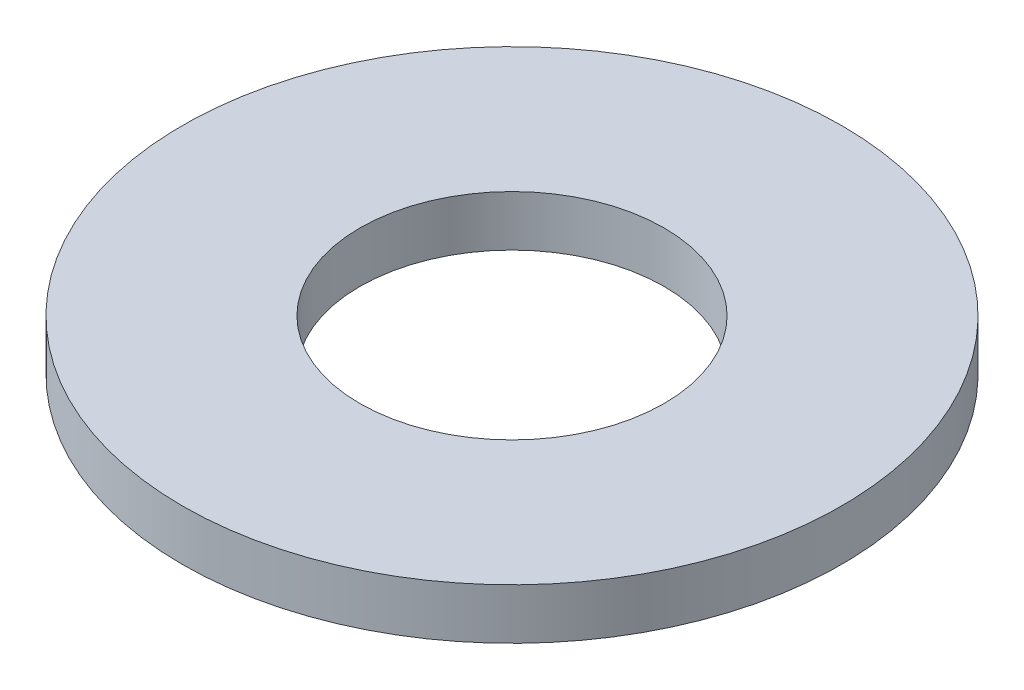
ISO-10303-21;
HEADER;
FILE_DESCRIPTION(('STEP AP214'),'2;1');
FILE_NAME('part.step','',(''),(''),'','','');
FILE_SCHEMA(('AUTOMOTIVE_DESIGN { 1 0 10303 214 1 1 1 1 }'));
ENDSEC;
DATA;
#1=APPLICATION_CONTEXT('core data for automotive mechanical design processes');
#2=APPLICATION_PROTOCOL_DEFINITION('international standard','automotive_design',2000,#1);
#3=PRODUCT_CONTEXT('',#1,'mechanical');
#4=PRODUCT('Part','Part','',(#3));
#5=PRODUCT_RELATED_PRODUCT_CATEGORY('part','',(#4));
#6=PRODUCT_DEFINITION_FORMATION('','',#4);
#7=PRODUCT_DEFINITION_CONTEXT('part definition',#1,'design');
#8=PRODUCT_DEFINITION('design','',#6,#7);
#9=PRODUCT_DEFINITION_SHAPE('','',#8);
#10=(LENGTH_UNIT() NAMED_UNIT(*) SI_UNIT(.MILLI.,.METRE.));
#11=(NAMED_UNIT(*) PLANE_ANGLE_UNIT() SI_UNIT($,.RADIAN.));
#12=(NAMED_UNIT(*) SI_UNIT($,.STERADIAN.) SOLID_ANGLE_UNIT());
#13=UNCERTAINTY_MEASURE_WITH_UNIT(LENGTH_MEASURE(1.E-05),#10,'distance_accuracy_value','');
#14=(GEOMETRIC_REPRESENTATION_CONTEXT(3) GLOBAL_UNCERTAINTY_ASSIGNED_CONTEXT((#13)) GLOBAL_UNIT_ASSIGNED_CONTEXT((#10,
#11,#12)) REPRESENTATION_CONTEXT('',''));
#15=CARTESIAN_POINT('',(0.,0.,0.));
#16=DIRECTION('',(0.,0.,1.));
#17=DIRECTION('',(1.,0.,0.));
#18=AXIS2_PLACEMENT_3D('',#15,#16,#17);
#19=CARTESIAN_POINT('',(0.,1.,0.));
#20=DIRECTION('',(0.,1.,0.));
#21=DIRECTION('',(0.,0.,1.));
#22=AXIS2_PLACEMENT_3D('',#19,#20,#21);
#23=PLANE('',#22);
#24=CARTESIAN_POINT('',(0.,1.,0.));
#25=DIRECTION('',(0.,1.,0.));
#26=DIRECTION('',(0.,0.,1.));
#27=AXIS2_PLACEMENT_3D('',#24,#25,#26);
#28=CIRCLE('',#27,6.5);
#29=CARTESIAN_POINT('',(0.,1.,6.5));
#30=VERTEX_POINT('',#29);
#31=EDGE_CURVE('E10',#30,#30,#28,.T.);
#32=ORIENTED_EDGE('',*,*,#31,.T.);
#33=EDGE_LOOP('',(#32));
#34=FACE_BOUND('',#33,.T.);
#35=CARTESIAN_POINT('',(0.,1.,0.));
#36=DIRECTION('',(0.,1.,0.));
#37=DIRECTION('',(0.,0.,1.));
#38=AXIS2_PLACEMENT_3D('',#35,#36,#37);
#39=CIRCLE('',#38,3.);
#40=CARTESIAN_POINT('',(0.,1.,3.));
#41=VERTEX_POINT('',#40);
#42=EDGE_CURVE('E48',#41,#41,#39,.T.);
#43=ORIENTED_EDGE('',*,*,#42,.F.);
#44=EDGE_LOOP('',(#43));
#45=FACE_BOUND('',#44,.T.);
#46=ADVANCED_FACE('F37',(#34,#45),#23,.T.);
#47=CARTESIAN_POINT('',(0.,0.,0.));
#48=DIRECTION('',(0.,1.,0.));
#49=DIRECTION('',(0.,0.,1.));
#50=AXIS2_PLACEMENT_3D('',#47,#48,#49);
#51=PLANE('',#50);
#52=CARTESIAN_POINT('',(0.,0.,0.));
#53=DIRECTION('',(0.,1.,0.));
#54=DIRECTION('',(0.,0.,1.));
#55=AXIS2_PLACEMENT_3D('',#52,#53,#54);
#56=CIRCLE('',#55,6.5);
#57=CARTESIAN_POINT('',(0.,0.,6.5));
#58=VERTEX_POINT('',#57);
#59=EDGE_CURVE('E41',#58,#58,#56,.T.);
#60=ORIENTED_EDGE('',*,*,#59,.F.);
#61=EDGE_LOOP('',(#60));
#62=FACE_BOUND('',#61,.T.);
#63=CARTESIAN_POINT('',(0.,0.,0.));
#64=DIRECTION('',(0.,1.,0.));
#65=DIRECTION('',(0.,0.,1.));
#66=AXIS2_PLACEMENT_3D('',#63,#64,#65);
#67=CIRCLE('',#66,3.);
#68=CARTESIAN_POINT('',(0.,0.,3.));
#69=VERTEX_POINT('',#68);
#70=EDGE_CURVE('E50',#69,#69,#67,.T.);
#71=ORIENTED_EDGE('',*,*,#70,.T.);
#72=EDGE_LOOP('',(#71));
#73=FACE_BOUND('',#72,.T.);
#74=ADVANCED_FACE('F60',(#62,#73),#51,.F.);
#75=CARTESIAN_POINT('',(0.,1.,0.));
#76=DIRECTION('',(0.,-1.,0.));
#77=DIRECTION('',(0.,0.,-1.));
#78=AXIS2_PLACEMENT_3D('',#75,#76,#77);
#79=CYLINDRICAL_SURFACE('',#78,6.5);
#80=ORIENTED_EDGE('',*,*,#31,.F.);
#81=EDGE_LOOP('',(#80));
#82=FACE_BOUND('',#81,.T.);
#83=ORIENTED_EDGE('',*,*,#59,.T.);
#84=EDGE_LOOP('',(#83));
#85=FACE_BOUND('',#84,.T.);
#86=ADVANCED_FACE('F39',(#82,#85),#79,.T.);
#87=CARTESIAN_POINT('',(0.,1.,0.));
#88=DIRECTION('',(0.,-1.,0.));
#89=DIRECTION('',(0.,0.,-1.));
#90=AXIS2_PLACEMENT_3D('',#87,#88,#89);
#91=CYLINDRICAL_SURFACE('',#90,3.);
#92=ORIENTED_EDGE('',*,*,#42,.T.);
#93=EDGE_LOOP('',(#92));
#94=FACE_BOUND('',#93,.T.);
#95=ORIENTED_EDGE('',*,*,#70,.F.);
#96=EDGE_LOOP('',(#95));
#97=FACE_BOUND('',#96,.T.);
#98=ADVANCED_FACE('F56',(#94,#97),#91,.F.);
#99=CLOSED_SHELL('',(#46,#74,#86,#98));
#100=MANIFOLD_SOLID_BREP('B2',#99);
#101=ADVANCED_BREP_SHAPE_REPRESENTATION('',(#18,#100),#14);
#102=SHAPE_DEFINITION_REPRESENTATION(#9,#101);
ENDSEC;
END-ISO-10303-21;
